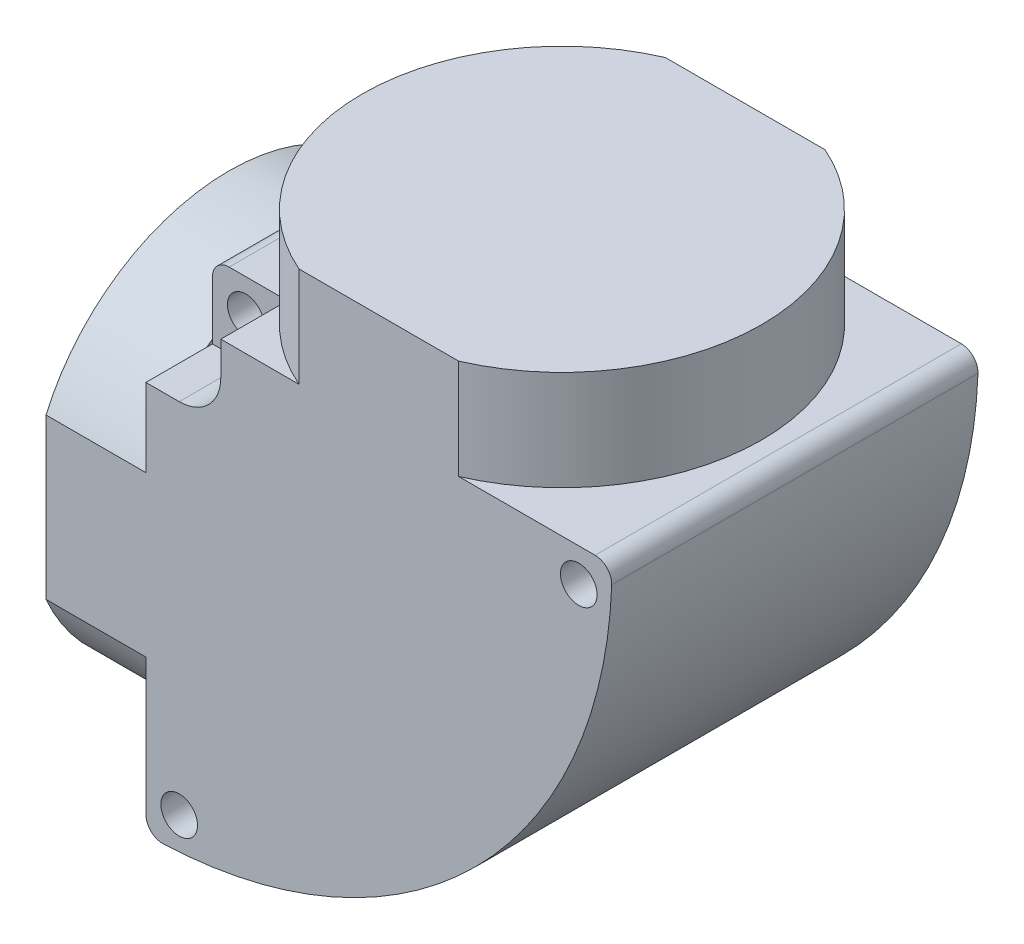
ISO-10303-21;
HEADER;
FILE_DESCRIPTION(('STEP AP214'),'2;1');
FILE_NAME('part.step','',(''),(''),'','','');
FILE_SCHEMA(('AUTOMOTIVE_DESIGN { 1 0 10303 214 1 1 1 1 }'));
ENDSEC;
DATA;
#1=APPLICATION_CONTEXT('core data for automotive mechanical design processes');
#2=APPLICATION_PROTOCOL_DEFINITION('international standard','automotive_design',2000,#1);
#3=PRODUCT_CONTEXT('',#1,'mechanical');
#4=PRODUCT('Part','Part','',(#3));
#5=PRODUCT_RELATED_PRODUCT_CATEGORY('part','',(#4));
#6=PRODUCT_DEFINITION_FORMATION('','',#4);
#7=PRODUCT_DEFINITION_CONTEXT('part definition',#1,'design');
#8=PRODUCT_DEFINITION('design','',#6,#7);
#9=PRODUCT_DEFINITION_SHAPE('','',#8);
#10=(LENGTH_UNIT() NAMED_UNIT(*) SI_UNIT(.MILLI.,.METRE.));
#11=(NAMED_UNIT(*) PLANE_ANGLE_UNIT() SI_UNIT($,.RADIAN.));
#12=(NAMED_UNIT(*) SI_UNIT($,.STERADIAN.) SOLID_ANGLE_UNIT());
#13=UNCERTAINTY_MEASURE_WITH_UNIT(LENGTH_MEASURE(1.E-05),#10,'distance_accuracy_value','');
#14=(GEOMETRIC_REPRESENTATION_CONTEXT(3) GLOBAL_UNCERTAINTY_ASSIGNED_CONTEXT((#13)) GLOBAL_UNIT_ASSIGNED_CONTEXT((#10,
#11,#12)) REPRESENTATION_CONTEXT('',''));
#15=CARTESIAN_POINT('',(0.,0.,0.));
#16=DIRECTION('',(0.,0.,1.));
#17=DIRECTION('',(1.,0.,0.));
#18=AXIS2_PLACEMENT_3D('',#15,#16,#17);
#19=CARTESIAN_POINT('',(0.,0.,22.));
#20=DIRECTION('',(0.,-1.,0.));
#21=DIRECTION('',(0.,0.,-1.));
#22=AXIS2_PLACEMENT_3D('',#19,#20,#21);
#23=PLANE('',#22);
#24=CARTESIAN_POINT('',(13.990737563232,0.,11.));
#25=DIRECTION('',(0.,1.,0.));
#26=DIRECTION('',(0.,0.,1.));
#27=AXIS2_PLACEMENT_3D('',#24,#25,#26);
#28=CIRCLE('',#27,12.);
#29=CARTESIAN_POINT('',(9.19490603991932,0.,0.));
#30=VERTEX_POINT('',#29);
#31=CARTESIAN_POINT('',(4.24394321842308,0.,18.));
#32=VERTEX_POINT('',#31);
#33=EDGE_CURVE('E55',#30,#32,#28,.T.);
#34=ORIENTED_EDGE('',*,*,#33,.F.);
#35=DIRECTION('',(-1.,0.,0.));
#36=VECTOR('',#35,1.);
#37=CARTESIAN_POINT('',(0.,0.,0.));
#38=LINE('',#37,#36);
#39=CARTESIAN_POINT('',(1.,0.,0.));
#40=VERTEX_POINT('',#39);
#41=EDGE_CURVE('E339',#30,#40,#38,.T.);
#42=ORIENTED_EDGE('',*,*,#41,.T.);
#43=DIRECTION('',(0.,0.,-1.));
#44=VECTOR('',#43,1.);
#45=CARTESIAN_POINT('',(1.,0.,22.));
#46=LINE('',#45,#44);
#47=CARTESIAN_POINT('',(1.,0.,18.));
#48=VERTEX_POINT('',#47);
#49=EDGE_CURVE('E330',#40,#48,#46,.F.);
#50=ORIENTED_EDGE('',*,*,#49,.T.);
#51=DIRECTION('',(-1.,0.,0.));
#52=VECTOR('',#51,1.);
#53=CARTESIAN_POINT('',(0.,0.,18.));
#54=LINE('',#53,#52);
#55=EDGE_CURVE('E285',#32,#48,#54,.T.);
#56=ORIENTED_EDGE('',*,*,#55,.F.);
#57=EDGE_LOOP('',(#34,#42,#50,#56));
#58=FACE_BOUND('',#57,.T.);
#59=ADVANCED_FACE('F39',(#58),#23,.F.);
#60=CARTESIAN_POINT('',(4.5,0.,18.3434256655771));
#61=VERTEX_POINT('',#60);
#62=CARTESIAN_POINT('',(9.19490603991933,0.,22.));
#63=VERTEX_POINT('',#62);
#64=EDGE_CURVE('E202',#61,#63,#28,.T.);
#65=ORIENTED_EDGE('',*,*,#64,.F.);
#66=DIRECTION('',(0.,0.,1.));
#67=VECTOR('',#66,1.);
#68=CARTESIAN_POINT('',(4.5,0.,22.));
#69=LINE('',#68,#67);
#70=CARTESIAN_POINT('',(4.5,0.,22.));
#71=VERTEX_POINT('',#70);
#72=EDGE_CURVE('E289',#61,#71,#69,.T.);
#73=ORIENTED_EDGE('',*,*,#72,.T.);
#74=DIRECTION('',(-1.,0.,0.));
#75=VECTOR('',#74,1.);
#76=CARTESIAN_POINT('',(0.,0.,22.));
#77=LINE('',#76,#75);
#78=EDGE_CURVE('E326',#63,#71,#77,.T.);
#79=ORIENTED_EDGE('',*,*,#78,.F.);
#80=EDGE_LOOP('',(#65,#73,#79));
#81=FACE_BOUND('',#80,.T.);
#82=ADVANCED_FACE('F437',(#81),#23,.F.);
#83=CARTESIAN_POINT('',(13.990737563232,0.,11.));
#84=DIRECTION('',(0.,1.,0.));
#85=DIRECTION('',(0.,0.,1.));
#86=AXIS2_PLACEMENT_3D('',#83,#84,#85);
#87=CIRCLE('',#86,12.);
#88=CARTESIAN_POINT('',(18.7865690865448,0.,22.));
#89=VERTEX_POINT('',#88);
#90=CARTESIAN_POINT('',(18.7865690865448,0.,0.));
#91=VERTEX_POINT('',#90);
#92=EDGE_CURVE('E198',#89,#91,#87,.T.);
#93=ORIENTED_EDGE('',*,*,#92,.F.);
#94=CARTESIAN_POINT('',(26.9814751264641,0.,22.));
#95=VERTEX_POINT('',#94);
#96=EDGE_CURVE('E327',#95,#89,#77,.T.);
#97=ORIENTED_EDGE('',*,*,#96,.F.);
#98=DIRECTION('',(0.,0.,-1.));
#99=VECTOR('',#98,1.);
#100=CARTESIAN_POINT('',(26.9814751264641,0.,22.));
#101=LINE('',#100,#99);
#102=CARTESIAN_POINT('',(26.9814751264641,0.,0.));
#103=VERTEX_POINT('',#102);
#104=EDGE_CURVE('E350',#95,#103,#101,.T.);
#105=ORIENTED_EDGE('',*,*,#104,.T.);
#106=EDGE_CURVE('E340',#103,#91,#38,.T.);
#107=ORIENTED_EDGE('',*,*,#106,.T.);
#108=EDGE_LOOP('',(#93,#97,#105,#107));
#109=FACE_BOUND('',#108,.T.);
#110=ADVANCED_FACE('F405',(#109),#23,.F.);
#111=CARTESIAN_POINT('',(0.,0.,22.));
#112=DIRECTION('',(1.,0.,0.));
#113=DIRECTION('',(0.,0.,-1.));
#114=AXIS2_PLACEMENT_3D('',#111,#112,#113);
#115=PLANE('',#114);
#116=CARTESIAN_POINT('',(0.,-13.990737563232,11.));
#117=DIRECTION('',(-1.,0.,0.));
#118=DIRECTION('',(0.,0.,1.));
#119=AXIS2_PLACEMENT_3D('',#116,#117,#118);
#120=CIRCLE('',#119,12.);
#121=CARTESIAN_POINT('',(0.,-9.19490603991932,22.));
#122=VERTEX_POINT('',#121);
#123=CARTESIAN_POINT('',(0.,-4.5,18.3434256655771));
#124=VERTEX_POINT('',#123);
#125=EDGE_CURVE('E210',#122,#124,#120,.T.);
#126=ORIENTED_EDGE('',*,*,#125,.F.);
#127=DIRECTION('',(0.,-1.,0.));
#128=VECTOR('',#127,1.);
#129=CARTESIAN_POINT('',(0.,0.,22.));
#130=LINE('',#129,#128);
#131=CARTESIAN_POINT('',(0.,-4.5,22.));
#132=VERTEX_POINT('',#131);
#133=EDGE_CURVE('E318',#132,#122,#130,.T.);
#134=ORIENTED_EDGE('',*,*,#133,.F.);
#135=DIRECTION('',(0.,0.,-1.));
#136=VECTOR('',#135,1.);
#137=CARTESIAN_POINT('',(0.,-4.5,22.));
#138=LINE('',#137,#136);
#139=EDGE_CURVE('E293',#132,#124,#138,.T.);
#140=ORIENTED_EDGE('',*,*,#139,.T.);
#141=EDGE_LOOP('',(#126,#134,#140));
#142=FACE_BOUND('',#141,.T.);
#143=ADVANCED_FACE('F447',(#142),#115,.F.);
#144=CARTESIAN_POINT('',(0.,-4.24394321842307,18.));
#145=VERTEX_POINT('',#144);
#146=CARTESIAN_POINT('',(0.,-9.19490603991933,0.));
#147=VERTEX_POINT('',#146);
#148=EDGE_CURVE('E204',#145,#147,#120,.T.);
#149=ORIENTED_EDGE('',*,*,#148,.F.);
#150=DIRECTION('',(0.,-1.,0.));
#151=VECTOR('',#150,1.);
#152=CARTESIAN_POINT('',(0.,0.,18.));
#153=LINE('',#152,#151);
#154=CARTESIAN_POINT('',(0.,-1.,18.));
#155=VERTEX_POINT('',#154);
#156=EDGE_CURVE('E286',#155,#145,#153,.T.);
#157=ORIENTED_EDGE('',*,*,#156,.F.);
#158=DIRECTION('',(0.,0.,-1.));
#159=VECTOR('',#158,1.);
#160=CARTESIAN_POINT('',(0.,-1.,22.));
#161=LINE('',#160,#159);
#162=CARTESIAN_POINT('',(0.,-1.,0.));
#163=VERTEX_POINT('',#162);
#164=EDGE_CURVE('E378',#155,#163,#161,.T.);
#165=ORIENTED_EDGE('',*,*,#164,.T.);
#166=DIRECTION('',(0.,-1.,0.));
#167=VECTOR('',#166,1.);
#168=CARTESIAN_POINT('',(0.,0.,0.));
#169=LINE('',#168,#167);
#170=EDGE_CURVE('E331',#163,#147,#169,.T.);
#171=ORIENTED_EDGE('',*,*,#170,.T.);
#172=EDGE_LOOP('',(#149,#157,#165,#171));
#173=FACE_BOUND('',#172,.T.);
#174=ADVANCED_FACE('F451',(#173),#115,.F.);
#175=CARTESIAN_POINT('',(0.,-13.990737563232,11.));
#176=DIRECTION('',(-1.,0.,0.));
#177=DIRECTION('',(0.,0.,1.));
#178=AXIS2_PLACEMENT_3D('',#175,#176,#177);
#179=CIRCLE('',#178,12.);
#180=CARTESIAN_POINT('',(0.,-18.7865690865448,0.));
#181=VERTEX_POINT('',#180);
#182=CARTESIAN_POINT('',(0.,-18.7865690865448,22.));
#183=VERTEX_POINT('',#182);
#184=EDGE_CURVE('E220',#181,#183,#179,.T.);
#185=ORIENTED_EDGE('',*,*,#184,.F.);
#186=CARTESIAN_POINT('',(0.,-26.9814751264641,0.));
#187=VERTEX_POINT('',#186);
#188=EDGE_CURVE('E317',#181,#187,#169,.T.);
#189=ORIENTED_EDGE('',*,*,#188,.T.);
#190=DIRECTION('',(0.,0.,-1.));
#191=VECTOR('',#190,1.);
#192=CARTESIAN_POINT('',(0.,-26.9814751264641,22.));
#193=LINE('',#192,#191);
#194=CARTESIAN_POINT('',(0.,-26.9814751264641,22.));
#195=VERTEX_POINT('',#194);
#196=EDGE_CURVE('E48',#187,#195,#193,.F.);
#197=ORIENTED_EDGE('',*,*,#196,.T.);
#198=EDGE_CURVE('E323',#183,#195,#130,.T.);
#199=ORIENTED_EDGE('',*,*,#198,.F.);
#200=EDGE_LOOP('',(#185,#189,#197,#199));
#201=FACE_BOUND('',#200,.T.);
#202=ADVANCED_FACE('F388',(#201),#115,.F.);
#203=CARTESIAN_POINT('',(2.,-2.,0.));
#204=DIRECTION('',(0.,0.,1.));
#205=DIRECTION('',(1.,0.,0.));
#206=AXIS2_PLACEMENT_3D('',#203,#204,#205);
#207=CYLINDRICAL_SURFACE('',#206,1.1);
#208=CARTESIAN_POINT('',(2.,-2.,0.));
#209=DIRECTION('',(0.,0.,1.));
#210=DIRECTION('',(1.,0.,0.));
#211=AXIS2_PLACEMENT_3D('',#208,#209,#210);
#212=CIRCLE('',#211,1.1);
#213=CARTESIAN_POINT('',(3.1,-2.,0.));
#214=VERTEX_POINT('',#213);
#215=EDGE_CURVE('E302',#214,#214,#212,.T.);
#216=ORIENTED_EDGE('',*,*,#215,.F.);
#217=EDGE_LOOP('',(#216));
#218=FACE_BOUND('',#217,.T.);
#219=CARTESIAN_POINT('',(2.,-2.,18.));
#220=DIRECTION('',(0.,0.,1.));
#221=DIRECTION('',(1.,0.,0.));
#222=AXIS2_PLACEMENT_3D('',#219,#220,#221);
#223=CIRCLE('',#222,1.1);
#224=CARTESIAN_POINT('',(3.1,-2.,18.));
#225=VERTEX_POINT('',#224);
#226=EDGE_CURVE('E276',#225,#225,#223,.F.);
#227=ORIENTED_EDGE('',*,*,#226,.F.);
#228=EDGE_LOOP('',(#227));
#229=FACE_BOUND('',#228,.T.);
#230=ADVANCED_FACE('F461',(#218,#229),#207,.F.);
#231=CARTESIAN_POINT('',(0.,0.,22.));
#232=DIRECTION('',(0.,0.,-1.));
#233=DIRECTION('',(-1.,0.,0.));
#234=AXIS2_PLACEMENT_3D('',#231,#232,#233);
#235=CYLINDRICAL_SURFACE('',#234,28.);
#236=CARTESIAN_POINT('',(0.,0.,0.));
#237=DIRECTION('',(0.,0.,1.));
#238=DIRECTION('',(-1.,0.,0.));
#239=AXIS2_PLACEMENT_3D('',#236,#237,#238);
#240=CIRCLE('',#239,28.);
#241=CARTESIAN_POINT('',(1.03703703703704,-27.9807890200368,0.));
#242=VERTEX_POINT('',#241);
#243=CARTESIAN_POINT('',(27.9807890200368,-1.03703703703704,0.));
#244=VERTEX_POINT('',#243);
#245=EDGE_CURVE('E335',#242,#244,#240,.T.);
#246=ORIENTED_EDGE('',*,*,#245,.T.);
#247=DIRECTION('',(0.,0.,-1.));
#248=VECTOR('',#247,1.);
#249=CARTESIAN_POINT('',(27.9807890200368,-1.03703703703704,22.));
#250=LINE('',#249,#248);
#251=CARTESIAN_POINT('',(27.9807890200368,-1.03703703703704,22.));
#252=VERTEX_POINT('',#251);
#253=EDGE_CURVE('E369',#244,#252,#250,.F.);
#254=ORIENTED_EDGE('',*,*,#253,.T.);
#255=CARTESIAN_POINT('',(0.,0.,22.));
#256=DIRECTION('',(0.,0.,1.));
#257=DIRECTION('',(-1.,0.,0.));
#258=AXIS2_PLACEMENT_3D('',#255,#256,#257);
#259=CIRCLE('',#258,28.);
#260=CARTESIAN_POINT('',(1.03703703703704,-27.9807890200368,22.));
#261=VERTEX_POINT('',#260);
#262=EDGE_CURVE('E322',#261,#252,#259,.T.);
#263=ORIENTED_EDGE('',*,*,#262,.F.);
#264=DIRECTION('',(0.,0.,-1.));
#265=VECTOR('',#264,1.);
#266=CARTESIAN_POINT('',(1.03703703703704,-27.9807890200368,22.));
#267=LINE('',#266,#265);
#268=EDGE_CURVE('E365',#261,#242,#267,.T.);
#269=ORIENTED_EDGE('',*,*,#268,.T.);
#270=EDGE_LOOP('',(#246,#254,#263,#269));
#271=FACE_BOUND('',#270,.T.);
#272=ADVANCED_FACE('F396',(#271),#235,.T.);
#273=CARTESIAN_POINT('',(0.,0.,22.));
#274=DIRECTION('',(0.,0.,-1.));
#275=DIRECTION('',(-1.,0.,0.));
#276=AXIS2_PLACEMENT_3D('',#273,#274,#275);
#277=PLANE('',#276);
#278=CARTESIAN_POINT('',(1.99999999999993,-26.,22.));
#279=DIRECTION('',(0.,0.,1.));
#280=DIRECTION('',(-1.,0.,0.));
#281=AXIS2_PLACEMENT_3D('',#278,#279,#280);
#282=CIRCLE('',#281,1.1);
#283=CARTESIAN_POINT('',(0.899999999999928,-26.,22.));
#284=VERTEX_POINT('',#283);
#285=EDGE_CURVE('E297',#284,#284,#282,.T.);
#286=ORIENTED_EDGE('',*,*,#285,.F.);
#287=EDGE_LOOP('',(#286));
#288=FACE_BOUND('',#287,.T.);
#289=CARTESIAN_POINT('',(26.,-2.,22.));
#290=DIRECTION('',(0.,0.,1.));
#291=DIRECTION('',(1.,0.,0.));
#292=AXIS2_PLACEMENT_3D('',#289,#290,#291);
#293=CIRCLE('',#292,1.1);
#294=CARTESIAN_POINT('',(27.1,-2.,22.));
#295=VERTEX_POINT('',#294);
#296=EDGE_CURVE('E303',#295,#295,#293,.T.);
#297=ORIENTED_EDGE('',*,*,#296,.F.);
#298=EDGE_LOOP('',(#297));
#299=FACE_BOUND('',#298,.T.);
#300=ORIENTED_EDGE('',*,*,#262,.T.);
#301=CARTESIAN_POINT('',(26.9814751264641,-1.,22.));
#302=DIRECTION('',(0.,0.,-1.));
#303=DIRECTION('',(-1.,0.,0.));
#304=AXIS2_PLACEMENT_3D('',#301,#302,#303);
#305=CIRCLE('',#304,1.);
#306=EDGE_CURVE('E375',#252,#95,#305,.F.);
#307=ORIENTED_EDGE('',*,*,#306,.T.);
#308=ORIENTED_EDGE('',*,*,#96,.T.);
#309=DIRECTION('',(0.,-1.,0.));
#310=VECTOR('',#309,1.);
#311=CARTESIAN_POINT('',(18.7865690865448,6.,22.));
#312=LINE('',#311,#310);
#313=CARTESIAN_POINT('',(18.7865690865448,6.,22.));
#314=VERTEX_POINT('',#313);
#315=EDGE_CURVE('E185',#314,#89,#312,.T.);
#316=ORIENTED_EDGE('',*,*,#315,.F.);
#317=DIRECTION('',(1.,0.,0.));
#318=VECTOR('',#317,1.);
#319=CARTESIAN_POINT('',(9.19490603991933,6.,22.));
#320=LINE('',#319,#318);
#321=CARTESIAN_POINT('',(9.19490603991933,6.,22.));
#322=VERTEX_POINT('',#321);
#323=EDGE_CURVE('E177',#322,#314,#320,.T.);
#324=ORIENTED_EDGE('',*,*,#323,.F.);
#325=DIRECTION('',(0.,-1.,0.));
#326=VECTOR('',#325,1.);
#327=CARTESIAN_POINT('',(9.19490603991933,6.,22.));
#328=LINE('',#327,#326);
#329=EDGE_CURVE('E182',#322,#63,#328,.T.);
#330=ORIENTED_EDGE('',*,*,#329,.T.);
#331=ORIENTED_EDGE('',*,*,#78,.T.);
#332=DIRECTION('',(0.,1.,0.));
#333=VECTOR('',#332,1.);
#334=CARTESIAN_POINT('',(4.5,-2.,22.));
#335=LINE('',#334,#333);
#336=CARTESIAN_POINT('',(4.5,-2.,22.));
#337=VERTEX_POINT('',#336);
#338=EDGE_CURVE('E266',#337,#71,#335,.T.);
#339=ORIENTED_EDGE('',*,*,#338,.F.);
#340=CARTESIAN_POINT('',(2.,-2.,22.));
#341=DIRECTION('',(0.,0.,1.));
#342=DIRECTION('',(1.,0.,0.));
#343=AXIS2_PLACEMENT_3D('',#340,#341,#342);
#344=CIRCLE('',#343,2.5);
#345=CARTESIAN_POINT('',(2.,-4.5,22.));
#346=VERTEX_POINT('',#345);
#347=EDGE_CURVE('E250',#346,#337,#344,.T.);
#348=ORIENTED_EDGE('',*,*,#347,.F.);
#349=DIRECTION('',(1.,0.,0.));
#350=VECTOR('',#349,1.);
#351=CARTESIAN_POINT('',(2.,-4.5,22.));
#352=LINE('',#351,#350);
#353=EDGE_CURVE('E256',#132,#346,#352,.T.);
#354=ORIENTED_EDGE('',*,*,#353,.F.);
#355=ORIENTED_EDGE('',*,*,#133,.T.);
#356=DIRECTION('',(1.,0.,0.));
#357=VECTOR('',#356,1.);
#358=CARTESIAN_POINT('',(-6.,-9.19490603991932,22.));
#359=LINE('',#358,#357);
#360=CARTESIAN_POINT('',(-6.,-9.19490603991932,22.));
#361=VERTEX_POINT('',#360);
#362=EDGE_CURVE('E228',#361,#122,#359,.T.);
#363=ORIENTED_EDGE('',*,*,#362,.F.);
#364=DIRECTION('',(0.,1.,0.));
#365=VECTOR('',#364,1.);
#366=CARTESIAN_POINT('',(-6.,-9.19490603991932,22.));
#367=LINE('',#366,#365);
#368=CARTESIAN_POINT('',(-6.,-18.7865690865448,22.));
#369=VERTEX_POINT('',#368);
#370=EDGE_CURVE('E226',#369,#361,#367,.T.);
#371=ORIENTED_EDGE('',*,*,#370,.F.);
#372=DIRECTION('',(1.,0.,0.));
#373=VECTOR('',#372,1.);
#374=CARTESIAN_POINT('',(-6.,-18.7865690865448,22.));
#375=LINE('',#374,#373);
#376=EDGE_CURVE('E236',#369,#183,#375,.T.);
#377=ORIENTED_EDGE('',*,*,#376,.T.);
#378=ORIENTED_EDGE('',*,*,#198,.T.);
#379=CARTESIAN_POINT('',(1.,-26.9814751264641,22.));
#380=DIRECTION('',(0.,0.,-1.));
#381=DIRECTION('',(-1.,0.,0.));
#382=AXIS2_PLACEMENT_3D('',#379,#380,#381);
#383=CIRCLE('',#382,1.);
#384=EDGE_CURVE('E372',#195,#261,#383,.F.);
#385=ORIENTED_EDGE('',*,*,#384,.T.);
#386=EDGE_LOOP('',(#300,#307,#308,#316,#324,#330,#331,#339,#348,#354,#355,#363,#371,#377,#378,#385));
#387=FACE_BOUND('',#386,.T.);
#388=ADVANCED_FACE('F180',(#288,#299,#387),#277,.F.);
#389=CARTESIAN_POINT('',(0.,0.,0.));
#390=DIRECTION('',(0.,0.,-1.));
#391=DIRECTION('',(-1.,0.,0.));
#392=AXIS2_PLACEMENT_3D('',#389,#390,#391);
#393=PLANE('',#392);
#394=CARTESIAN_POINT('',(1.99999999999993,-26.,0.));
#395=DIRECTION('',(0.,0.,1.));
#396=DIRECTION('',(-1.,0.,0.));
#397=AXIS2_PLACEMENT_3D('',#394,#395,#396);
#398=CIRCLE('',#397,1.1);
#399=CARTESIAN_POINT('',(0.899999999999928,-26.,0.));
#400=VERTEX_POINT('',#399);
#401=EDGE_CURVE('E307',#400,#400,#398,.T.);
#402=ORIENTED_EDGE('',*,*,#401,.T.);
#403=EDGE_LOOP('',(#402));
#404=FACE_BOUND('',#403,.T.);
#405=CARTESIAN_POINT('',(26.,-2.,0.));
#406=DIRECTION('',(0.,0.,1.));
#407=DIRECTION('',(1.,0.,0.));
#408=AXIS2_PLACEMENT_3D('',#405,#406,#407);
#409=CIRCLE('',#408,1.1);
#410=CARTESIAN_POINT('',(27.1,-2.,0.));
#411=VERTEX_POINT('',#410);
#412=EDGE_CURVE('E298',#411,#411,#409,.T.);
#413=ORIENTED_EDGE('',*,*,#412,.T.);
#414=EDGE_LOOP('',(#413));
#415=FACE_BOUND('',#414,.T.);
#416=ORIENTED_EDGE('',*,*,#215,.T.);
#417=EDGE_LOOP('',(#416));
#418=FACE_BOUND('',#417,.T.);
#419=ORIENTED_EDGE('',*,*,#106,.F.);
#420=CARTESIAN_POINT('',(26.9814751264641,-1.,0.));
#421=DIRECTION('',(0.,0.,-1.));
#422=DIRECTION('',(-1.,0.,0.));
#423=AXIS2_PLACEMENT_3D('',#420,#421,#422);
#424=CIRCLE('',#423,1.);
#425=EDGE_CURVE('E362',#103,#244,#424,.T.);
#426=ORIENTED_EDGE('',*,*,#425,.T.);
#427=ORIENTED_EDGE('',*,*,#245,.F.);
#428=CARTESIAN_POINT('',(1.,-26.9814751264641,0.));
#429=DIRECTION('',(0.,0.,-1.));
#430=DIRECTION('',(-1.,0.,0.));
#431=AXIS2_PLACEMENT_3D('',#428,#429,#430);
#432=CIRCLE('',#431,1.);
#433=EDGE_CURVE('E358',#242,#187,#432,.T.);
#434=ORIENTED_EDGE('',*,*,#433,.T.);
#435=ORIENTED_EDGE('',*,*,#188,.F.);
#436=DIRECTION('',(1.,0.,0.));
#437=VECTOR('',#436,1.);
#438=CARTESIAN_POINT('',(-6.,-18.7865690865448,0.));
#439=LINE('',#438,#437);
#440=CARTESIAN_POINT('',(-6.,-18.7865690865448,0.));
#441=VERTEX_POINT('',#440);
#442=EDGE_CURVE('E240',#441,#181,#439,.T.);
#443=ORIENTED_EDGE('',*,*,#442,.F.);
#444=DIRECTION('',(0.,-1.,0.));
#445=VECTOR('',#444,1.);
#446=CARTESIAN_POINT('',(-6.,-9.19490603991933,0.));
#447=LINE('',#446,#445);
#448=CARTESIAN_POINT('',(-6.,-9.19490603991933,0.));
#449=VERTEX_POINT('',#448);
#450=EDGE_CURVE('E219',#449,#441,#447,.T.);
#451=ORIENTED_EDGE('',*,*,#450,.F.);
#452=DIRECTION('',(1.,0.,0.));
#453=VECTOR('',#452,1.);
#454=CARTESIAN_POINT('',(-6.,-9.19490603991933,0.));
#455=LINE('',#454,#453);
#456=EDGE_CURVE('E243',#449,#147,#455,.T.);
#457=ORIENTED_EDGE('',*,*,#456,.T.);
#458=ORIENTED_EDGE('',*,*,#170,.F.);
#459=CARTESIAN_POINT('',(1.,-1.,0.));
#460=DIRECTION('',(0.,0.,-1.));
#461=DIRECTION('',(-1.,0.,0.));
#462=AXIS2_PLACEMENT_3D('',#459,#460,#461);
#463=CIRCLE('',#462,1.);
#464=EDGE_CURVE('E354',#163,#40,#463,.T.);
#465=ORIENTED_EDGE('',*,*,#464,.T.);
#466=ORIENTED_EDGE('',*,*,#41,.F.);
#467=DIRECTION('',(0.,-1.,0.));
#468=VECTOR('',#467,1.);
#469=CARTESIAN_POINT('',(9.19490603991932,6.,0.));
#470=LINE('',#469,#468);
#471=CARTESIAN_POINT('',(9.19490603991932,6.,0.));
#472=VERTEX_POINT('',#471);
#473=EDGE_CURVE('E417',#472,#30,#470,.T.);
#474=ORIENTED_EDGE('',*,*,#473,.F.);
#475=DIRECTION('',(-1.,0.,0.));
#476=VECTOR('',#475,1.);
#477=CARTESIAN_POINT('',(9.19490603991932,6.,0.));
#478=LINE('',#477,#476);
#479=CARTESIAN_POINT('',(18.7865690865448,6.,0.));
#480=VERTEX_POINT('',#479);
#481=EDGE_CURVE('E195',#480,#472,#478,.T.);
#482=ORIENTED_EDGE('',*,*,#481,.F.);
#483=DIRECTION('',(0.,-1.,0.));
#484=VECTOR('',#483,1.);
#485=CARTESIAN_POINT('',(18.7865690865448,6.,0.));
#486=LINE('',#485,#484);
#487=EDGE_CURVE('E211',#480,#91,#486,.T.);
#488=ORIENTED_EDGE('',*,*,#487,.T.);
#489=EDGE_LOOP('',(#419,#426,#427,#434,#435,#443,#451,#457,#458,#465,#466,#474,#482,#488));
#490=FACE_BOUND('',#489,.T.);
#491=ADVANCED_FACE('F421',(#404,#415,#418,#490),#393,.T.);
#492=CARTESIAN_POINT('',(26.,-2.,0.));
#493=DIRECTION('',(0.,0.,1.));
#494=DIRECTION('',(1.,0.,0.));
#495=AXIS2_PLACEMENT_3D('',#492,#493,#494);
#496=CYLINDRICAL_SURFACE('',#495,1.1);
#497=ORIENTED_EDGE('',*,*,#412,.F.);
#498=EDGE_LOOP('',(#497));
#499=FACE_BOUND('',#498,.T.);
#500=ORIENTED_EDGE('',*,*,#296,.T.);
#501=EDGE_LOOP('',(#500));
#502=FACE_BOUND('',#501,.T.);
#503=ADVANCED_FACE('F479',(#499,#502),#496,.F.);
#504=CARTESIAN_POINT('',(1.99999999999993,-26.,0.));
#505=DIRECTION('',(0.,0.,1.));
#506=DIRECTION('',(1.,0.,0.));
#507=AXIS2_PLACEMENT_3D('',#504,#505,#506);
#508=CYLINDRICAL_SURFACE('',#507,1.1);
#509=ORIENTED_EDGE('',*,*,#401,.F.);
#510=EDGE_LOOP('',(#509));
#511=FACE_BOUND('',#510,.T.);
#512=ORIENTED_EDGE('',*,*,#285,.T.);
#513=EDGE_LOOP('',(#512));
#514=FACE_BOUND('',#513,.T.);
#515=ADVANCED_FACE('F474',(#511,#514),#508,.F.);
#516=CARTESIAN_POINT('',(2.,-4.5,18.));
#517=DIRECTION('',(0.,-1.,0.));
#518=DIRECTION('',(0.,0.,-1.));
#519=AXIS2_PLACEMENT_3D('',#516,#517,#518);
#520=PLANE('',#519);
#521=ORIENTED_EDGE('',*,*,#353,.T.);
#522=DIRECTION('',(0.,0.,1.));
#523=VECTOR('',#522,1.);
#524=CARTESIAN_POINT('',(2.,-4.5,18.));
#525=LINE('',#524,#523);
#526=CARTESIAN_POINT('',(2.,-4.5,18.));
#527=VERTEX_POINT('',#526);
#528=EDGE_CURVE('E272',#527,#346,#525,.T.);
#529=ORIENTED_EDGE('',*,*,#528,.F.);
#530=DIRECTION('',(1.,0.,0.));
#531=VECTOR('',#530,1.);
#532=CARTESIAN_POINT('',(2.,-4.5,18.));
#533=LINE('',#532,#531);
#534=CARTESIAN_POINT('',(0.,-4.5,18.));
#535=VERTEX_POINT('',#534);
#536=EDGE_CURVE('E260',#535,#527,#533,.T.);
#537=ORIENTED_EDGE('',*,*,#536,.F.);
#538=DIRECTION('',(0.,0.,-1.));
#539=VECTOR('',#538,1.);
#540=CARTESIAN_POINT('',(0.,-4.5,18.));
#541=LINE('',#540,#539);
#542=EDGE_CURVE('E247',#124,#535,#541,.T.);
#543=ORIENTED_EDGE('',*,*,#542,.F.);
#544=ORIENTED_EDGE('',*,*,#139,.F.);
#545=EDGE_LOOP('',(#521,#529,#537,#543,#544));
#546=FACE_BOUND('',#545,.T.);
#547=ADVANCED_FACE('F495',(#546),#520,.F.);
#548=CARTESIAN_POINT('',(4.5,-2.,18.));
#549=DIRECTION('',(1.,0.,0.));
#550=DIRECTION('',(0.,0.,-1.));
#551=AXIS2_PLACEMENT_3D('',#548,#549,#550);
#552=PLANE('',#551);
#553=DIRECTION('',(0.,1.,0.));
#554=VECTOR('',#553,1.);
#555=CARTESIAN_POINT('',(4.5,-2.,18.));
#556=LINE('',#555,#554);
#557=CARTESIAN_POINT('',(4.5,-2.,18.));
#558=VERTEX_POINT('',#557);
#559=CARTESIAN_POINT('',(4.5,0.,18.));
#560=VERTEX_POINT('',#559);
#561=EDGE_CURVE('E255',#558,#560,#556,.T.);
#562=ORIENTED_EDGE('',*,*,#561,.F.);
#563=DIRECTION('',(0.,0.,1.));
#564=VECTOR('',#563,1.);
#565=CARTESIAN_POINT('',(4.5,-2.,18.));
#566=LINE('',#565,#564);
#567=EDGE_CURVE('E263',#558,#337,#566,.T.);
#568=ORIENTED_EDGE('',*,*,#567,.T.);
#569=ORIENTED_EDGE('',*,*,#338,.T.);
#570=ORIENTED_EDGE('',*,*,#72,.F.);
#571=EDGE_CURVE('E290',#560,#61,#69,.T.);
#572=ORIENTED_EDGE('',*,*,#571,.F.);
#573=EDGE_LOOP('',(#562,#568,#569,#570,#572));
#574=FACE_BOUND('',#573,.T.);
#575=ADVANCED_FACE('F500',(#574),#552,.F.);
#576=CARTESIAN_POINT('',(2.,-2.,18.));
#577=DIRECTION('',(0.,0.,1.));
#578=DIRECTION('',(1.,0.,0.));
#579=AXIS2_PLACEMENT_3D('',#576,#577,#578);
#580=PLANE('',#579);
#581=ORIENTED_EDGE('',*,*,#226,.T.);
#582=EDGE_LOOP('',(#581));
#583=FACE_BOUND('',#582,.T.);
#584=EDGE_CURVE('E280',#560,#32,#54,.T.);
#585=ORIENTED_EDGE('',*,*,#584,.T.);
#586=ORIENTED_EDGE('',*,*,#55,.T.);
#587=CARTESIAN_POINT('',(1.,-1.,18.));
#588=DIRECTION('',(0.,0.,1.));
#589=DIRECTION('',(1.,0.,0.));
#590=AXIS2_PLACEMENT_3D('',#587,#588,#589);
#591=CIRCLE('',#590,1.);
#592=EDGE_CURVE('E11',#48,#155,#591,.T.);
#593=ORIENTED_EDGE('',*,*,#592,.T.);
#594=ORIENTED_EDGE('',*,*,#156,.T.);
#595=EDGE_CURVE('E284',#145,#535,#153,.T.);
#596=ORIENTED_EDGE('',*,*,#595,.T.);
#597=ORIENTED_EDGE('',*,*,#536,.T.);
#598=CARTESIAN_POINT('',(2.,-2.,18.));
#599=DIRECTION('',(0.,0.,1.));
#600=DIRECTION('',(1.,0.,0.));
#601=AXIS2_PLACEMENT_3D('',#598,#599,#600);
#602=CIRCLE('',#601,2.5);
#603=EDGE_CURVE('E251',#527,#558,#602,.T.);
#604=ORIENTED_EDGE('',*,*,#603,.T.);
#605=ORIENTED_EDGE('',*,*,#561,.T.);
#606=EDGE_LOOP('',(#585,#586,#593,#594,#596,#597,#604,#605));
#607=FACE_BOUND('',#606,.T.);
#608=ADVANCED_FACE('F506',(#583,#607),#580,.T.);
#609=CARTESIAN_POINT('',(2.,-2.,18.));
#610=DIRECTION('',(0.,0.,1.));
#611=DIRECTION('',(1.,0.,0.));
#612=AXIS2_PLACEMENT_3D('',#609,#610,#611);
#613=CYLINDRICAL_SURFACE('',#612,2.5);
#614=ORIENTED_EDGE('',*,*,#347,.T.);
#615=ORIENTED_EDGE('',*,*,#567,.F.);
#616=ORIENTED_EDGE('',*,*,#603,.F.);
#617=ORIENTED_EDGE('',*,*,#528,.T.);
#618=EDGE_LOOP('',(#614,#615,#616,#617));
#619=FACE_BOUND('',#618,.T.);
#620=ADVANCED_FACE('F512',(#619),#613,.F.);
#621=CARTESIAN_POINT('',(26.9814751264641,-1.,22.));
#622=DIRECTION('',(0.,0.,-1.));
#623=DIRECTION('',(-1.,0.,0.));
#624=AXIS2_PLACEMENT_3D('',#621,#622,#623);
#625=CYLINDRICAL_SURFACE('',#624,1.);
#626=ORIENTED_EDGE('',*,*,#306,.F.);
#627=ORIENTED_EDGE('',*,*,#253,.F.);
#628=ORIENTED_EDGE('',*,*,#425,.F.);
#629=ORIENTED_EDGE('',*,*,#104,.F.);
#630=EDGE_LOOP('',(#626,#627,#628,#629));
#631=FACE_BOUND('',#630,.T.);
#632=ADVANCED_FACE('F400',(#631),#625,.T.);
#633=CARTESIAN_POINT('',(1.,-26.9814751264641,22.));
#634=DIRECTION('',(0.,0.,-1.));
#635=DIRECTION('',(-1.,0.,0.));
#636=AXIS2_PLACEMENT_3D('',#633,#634,#635);
#637=CYLINDRICAL_SURFACE('',#636,1.);
#638=ORIENTED_EDGE('',*,*,#384,.F.);
#639=ORIENTED_EDGE('',*,*,#196,.F.);
#640=ORIENTED_EDGE('',*,*,#433,.F.);
#641=ORIENTED_EDGE('',*,*,#268,.F.);
#642=EDGE_LOOP('',(#638,#639,#640,#641));
#643=FACE_BOUND('',#642,.T.);
#644=ADVANCED_FACE('F392',(#643),#637,.T.);
#645=CARTESIAN_POINT('',(1.,-1.,22.));
#646=DIRECTION('',(0.,0.,-1.));
#647=DIRECTION('',(-1.,0.,0.));
#648=AXIS2_PLACEMENT_3D('',#645,#646,#647);
#649=CYLINDRICAL_SURFACE('',#648,1.);
#650=ORIENTED_EDGE('',*,*,#592,.F.);
#651=ORIENTED_EDGE('',*,*,#49,.F.);
#652=ORIENTED_EDGE('',*,*,#464,.F.);
#653=ORIENTED_EDGE('',*,*,#164,.F.);
#654=EDGE_LOOP('',(#650,#651,#652,#653));
#655=FACE_BOUND('',#654,.T.);
#656=ADVANCED_FACE('F41',(#655),#649,.T.);
#657=CARTESIAN_POINT('',(0.,-13.990737563232,11.));
#658=DIRECTION('',(-1.,0.,0.));
#659=DIRECTION('',(0.,0.,1.));
#660=AXIS2_PLACEMENT_3D('',#657,#658,#659);
#661=PLANE('',#660);
#662=EDGE_CURVE('E208',#124,#145,#120,.T.);
#663=ORIENTED_EDGE('',*,*,#662,.F.);
#664=ORIENTED_EDGE('',*,*,#542,.T.);
#665=ORIENTED_EDGE('',*,*,#595,.F.);
#666=EDGE_LOOP('',(#663,#664,#665));
#667=FACE_BOUND('',#666,.T.);
#668=ADVANCED_FACE('F572',(#667),#661,.F.);
#669=CARTESIAN_POINT('',(-6.,-13.990737563232,11.));
#670=DIRECTION('',(1.,0.,0.));
#671=DIRECTION('',(0.,0.,-1.));
#672=AXIS2_PLACEMENT_3D('',#669,#670,#671);
#673=CYLINDRICAL_SURFACE('',#672,12.);
#674=ORIENTED_EDGE('',*,*,#125,.T.);
#675=ORIENTED_EDGE('',*,*,#662,.T.);
#676=ORIENTED_EDGE('',*,*,#148,.T.);
#677=ORIENTED_EDGE('',*,*,#456,.F.);
#678=CARTESIAN_POINT('',(-6.,-13.990737563232,11.));
#679=DIRECTION('',(-1.,0.,0.));
#680=DIRECTION('',(0.,0.,1.));
#681=AXIS2_PLACEMENT_3D('',#678,#679,#680);
#682=CIRCLE('',#681,12.);
#683=EDGE_CURVE('E215',#361,#449,#682,.T.);
#684=ORIENTED_EDGE('',*,*,#683,.F.);
#685=ORIENTED_EDGE('',*,*,#362,.T.);
#686=EDGE_LOOP('',(#674,#675,#676,#677,#684,#685));
#687=FACE_BOUND('',#686,.T.);
#688=ADVANCED_FACE('F538',(#687),#673,.T.);
#689=CARTESIAN_POINT('',(-6.,-13.990737563232,11.));
#690=DIRECTION('',(1.,0.,0.));
#691=DIRECTION('',(0.,0.,-1.));
#692=AXIS2_PLACEMENT_3D('',#689,#690,#691);
#693=CYLINDRICAL_SURFACE('',#692,12.);
#694=ORIENTED_EDGE('',*,*,#184,.T.);
#695=ORIENTED_EDGE('',*,*,#376,.F.);
#696=CARTESIAN_POINT('',(-6.,-13.990737563232,11.));
#697=DIRECTION('',(-1.,0.,0.));
#698=DIRECTION('',(0.,0.,1.));
#699=AXIS2_PLACEMENT_3D('',#696,#697,#698);
#700=CIRCLE('',#699,12.);
#701=EDGE_CURVE('E223',#441,#369,#700,.T.);
#702=ORIENTED_EDGE('',*,*,#701,.F.);
#703=ORIENTED_EDGE('',*,*,#442,.T.);
#704=EDGE_LOOP('',(#694,#695,#702,#703));
#705=FACE_BOUND('',#704,.T.);
#706=ADVANCED_FACE('F561',(#705),#693,.T.);
#707=CARTESIAN_POINT('',(-6.,-13.990737563232,11.));
#708=DIRECTION('',(-1.,0.,0.));
#709=DIRECTION('',(0.,0.,1.));
#710=AXIS2_PLACEMENT_3D('',#707,#708,#709);
#711=PLANE('',#710);
#712=ORIENTED_EDGE('',*,*,#683,.T.);
#713=ORIENTED_EDGE('',*,*,#450,.T.);
#714=ORIENTED_EDGE('',*,*,#701,.T.);
#715=ORIENTED_EDGE('',*,*,#370,.T.);
#716=EDGE_LOOP('',(#712,#713,#714,#715));
#717=FACE_BOUND('',#716,.T.);
#718=ADVANCED_FACE('F555',(#717),#711,.T.);
#719=CARTESIAN_POINT('',(13.990737563232,0.,11.));
#720=DIRECTION('',(0.,1.,0.));
#721=DIRECTION('',(0.,0.,1.));
#722=AXIS2_PLACEMENT_3D('',#719,#720,#721);
#723=PLANE('',#722);
#724=ORIENTED_EDGE('',*,*,#584,.F.);
#725=ORIENTED_EDGE('',*,*,#571,.T.);
#726=EDGE_CURVE('E413',#32,#61,#28,.T.);
#727=ORIENTED_EDGE('',*,*,#726,.F.);
#728=EDGE_LOOP('',(#724,#725,#727));
#729=FACE_BOUND('',#728,.T.);
#730=ADVANCED_FACE('F433',(#729),#723,.F.);
#731=CARTESIAN_POINT('',(13.990737563232,6.,11.));
#732=DIRECTION('',(0.,-1.,0.));
#733=DIRECTION('',(0.,0.,-1.));
#734=AXIS2_PLACEMENT_3D('',#731,#732,#733);
#735=CYLINDRICAL_SURFACE('',#734,12.);
#736=ORIENTED_EDGE('',*,*,#33,.T.);
#737=ORIENTED_EDGE('',*,*,#726,.T.);
#738=ORIENTED_EDGE('',*,*,#64,.T.);
#739=ORIENTED_EDGE('',*,*,#329,.F.);
#740=CARTESIAN_POINT('',(13.990737563232,6.,11.));
#741=DIRECTION('',(0.,1.,0.));
#742=DIRECTION('',(0.,0.,1.));
#743=AXIS2_PLACEMENT_3D('',#740,#741,#742);
#744=CIRCLE('',#743,12.);
#745=EDGE_CURVE('E190',#472,#322,#744,.T.);
#746=ORIENTED_EDGE('',*,*,#745,.F.);
#747=ORIENTED_EDGE('',*,*,#473,.T.);
#748=EDGE_LOOP('',(#736,#737,#738,#739,#746,#747));
#749=FACE_BOUND('',#748,.T.);
#750=ADVANCED_FACE('F200',(#749),#735,.T.);
#751=CARTESIAN_POINT('',(13.990737563232,6.,11.));
#752=DIRECTION('',(0.,-1.,0.));
#753=DIRECTION('',(0.,0.,-1.));
#754=AXIS2_PLACEMENT_3D('',#751,#752,#753);
#755=CYLINDRICAL_SURFACE('',#754,12.);
#756=ORIENTED_EDGE('',*,*,#92,.T.);
#757=ORIENTED_EDGE('',*,*,#487,.F.);
#758=CARTESIAN_POINT('',(13.990737563232,6.,11.));
#759=DIRECTION('',(0.,1.,0.));
#760=DIRECTION('',(0.,0.,1.));
#761=AXIS2_PLACEMENT_3D('',#758,#759,#760);
#762=CIRCLE('',#761,12.);
#763=EDGE_CURVE('E189',#314,#480,#762,.T.);
#764=ORIENTED_EDGE('',*,*,#763,.F.);
#765=ORIENTED_EDGE('',*,*,#315,.T.);
#766=EDGE_LOOP('',(#756,#757,#764,#765));
#767=FACE_BOUND('',#766,.T.);
#768=ADVANCED_FACE('F422',(#767),#755,.T.);
#769=CARTESIAN_POINT('',(13.990737563232,6.,11.));
#770=DIRECTION('',(0.,1.,0.));
#771=DIRECTION('',(0.,0.,1.));
#772=AXIS2_PLACEMENT_3D('',#769,#770,#771);
#773=PLANE('',#772);
#774=ORIENTED_EDGE('',*,*,#745,.T.);
#775=ORIENTED_EDGE('',*,*,#323,.T.);
#776=ORIENTED_EDGE('',*,*,#763,.T.);
#777=ORIENTED_EDGE('',*,*,#481,.T.);
#778=EDGE_LOOP('',(#774,#775,#776,#777));
#779=FACE_BOUND('',#778,.T.);
#780=ADVANCED_FACE('F193',(#779),#773,.T.);
#781=CLOSED_SHELL('',(#59,#82,#110,#143,#174,#202,#230,#272,#388,#491,#503,#515,#547,#575,#608,
#620,#632,#644,#656,#668,#688,#706,#718,#730,#750,#768,#780));
#782=MANIFOLD_SOLID_BREP('B2',#781);
#783=ADVANCED_BREP_SHAPE_REPRESENTATION('',(#18,#782),#14);
#784=SHAPE_DEFINITION_REPRESENTATION(#9,#783);
ENDSEC;
END-ISO-10303-21;
